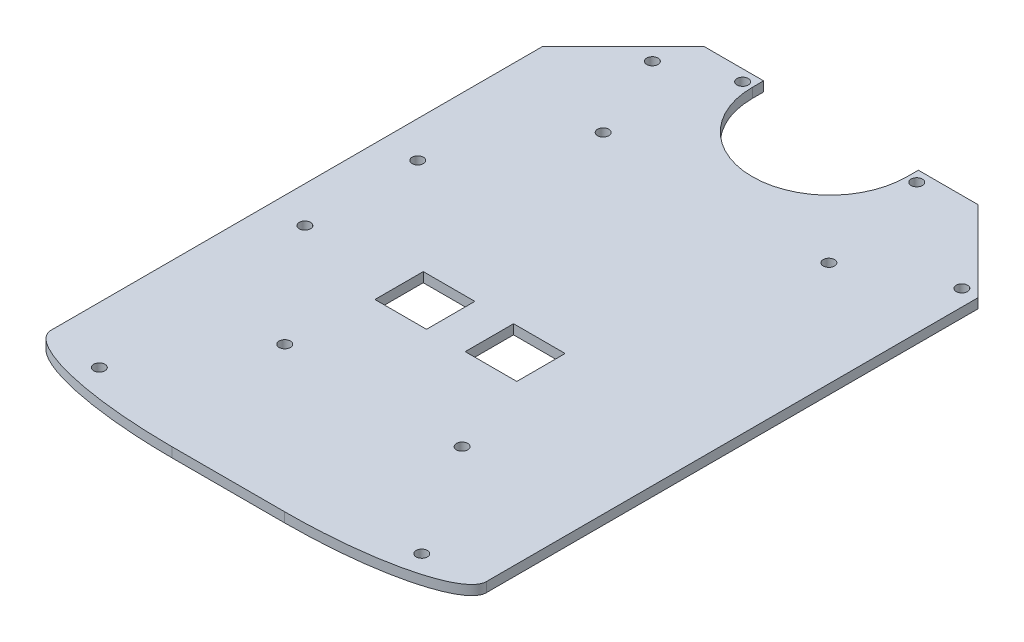
ISO-10303-21;
HEADER;
FILE_DESCRIPTION(('STEP AP214'),'2;1');
FILE_NAME('part.step','',(''),(''),'','','');
FILE_SCHEMA(('AUTOMOTIVE_DESIGN { 1 0 10303 214 1 1 1 1 }'));
ENDSEC;
DATA;
#1=APPLICATION_CONTEXT('core data for automotive mechanical design processes');
#2=APPLICATION_PROTOCOL_DEFINITION('international standard','automotive_design',2000,#1);
#3=PRODUCT_CONTEXT('',#1,'mechanical');
#4=PRODUCT('Part','Part','',(#3));
#5=PRODUCT_RELATED_PRODUCT_CATEGORY('part','',(#4));
#6=PRODUCT_DEFINITION_FORMATION('','',#4);
#7=PRODUCT_DEFINITION_CONTEXT('part definition',#1,'design');
#8=PRODUCT_DEFINITION('design','',#6,#7);
#9=PRODUCT_DEFINITION_SHAPE('','',#8);
#10=(LENGTH_UNIT() NAMED_UNIT(*) SI_UNIT(.MILLI.,.METRE.));
#11=(NAMED_UNIT(*) PLANE_ANGLE_UNIT() SI_UNIT($,.RADIAN.));
#12=(NAMED_UNIT(*) SI_UNIT($,.STERADIAN.) SOLID_ANGLE_UNIT());
#13=UNCERTAINTY_MEASURE_WITH_UNIT(LENGTH_MEASURE(1.E-05),#10,'distance_accuracy_value','');
#14=(GEOMETRIC_REPRESENTATION_CONTEXT(3) GLOBAL_UNCERTAINTY_ASSIGNED_CONTEXT((#13)) GLOBAL_UNIT_ASSIGNED_CONTEXT((#10,
#11,#12)) REPRESENTATION_CONTEXT('',''));
#15=CARTESIAN_POINT('',(0.,0.,0.));
#16=DIRECTION('',(0.,0.,1.));
#17=DIRECTION('',(1.,0.,0.));
#18=AXIS2_PLACEMENT_3D('',#15,#16,#17);
#19=CARTESIAN_POINT('',(-67.5,3.,-95.));
#20=DIRECTION('',(0.,0.,1.));
#21=DIRECTION('',(1.,0.,0.));
#22=AXIS2_PLACEMENT_3D('',#19,#20,#21);
#23=PLANE('',#22);
#24=DIRECTION('',(-1.,0.,0.));
#25=VECTOR('',#24,1.);
#26=CARTESIAN_POINT('',(-67.5,3.,-95.));
#27=LINE('',#26,#25);
#28=CARTESIAN_POINT('',(-24.,3.,-95.));
#29=VERTEX_POINT('',#28);
#30=CARTESIAN_POINT('',(-42.5,3.,-95.));
#31=VERTEX_POINT('',#30);
#32=EDGE_CURVE('E310',#29,#31,#27,.T.);
#33=ORIENTED_EDGE('',*,*,#32,.F.);
#34=DIRECTION('',(0.,1.,0.));
#35=VECTOR('',#34,1.);
#36=CARTESIAN_POINT('',(-24.,-0.25,-95.));
#37=LINE('',#36,#35);
#38=CARTESIAN_POINT('',(-24.,0.,-95.));
#39=VERTEX_POINT('',#38);
#40=EDGE_CURVE('E271',#39,#29,#37,.T.);
#41=ORIENTED_EDGE('',*,*,#40,.F.);
#42=DIRECTION('',(-1.,0.,0.));
#43=VECTOR('',#42,1.);
#44=CARTESIAN_POINT('',(-67.5,0.,-95.));
#45=LINE('',#44,#43);
#46=CARTESIAN_POINT('',(-42.5,0.,-95.));
#47=VERTEX_POINT('',#46);
#48=EDGE_CURVE('E459',#39,#47,#45,.T.);
#49=ORIENTED_EDGE('',*,*,#48,.T.);
#50=DIRECTION('',(0.,1.,0.));
#51=VECTOR('',#50,1.);
#52=CARTESIAN_POINT('',(-42.5,3.,-95.));
#53=LINE('',#52,#51);
#54=EDGE_CURVE('E473',#47,#31,#53,.T.);
#55=ORIENTED_EDGE('',*,*,#54,.T.);
#56=EDGE_LOOP('',(#33,#41,#49,#55));
#57=FACE_BOUND('',#56,.T.);
#58=ADVANCED_FACE('F41',(#57),#23,.F.);
#59=CARTESIAN_POINT('',(67.5,3.,-95.));
#60=DIRECTION('',(-1.,0.,0.));
#61=DIRECTION('',(0.,0.,1.));
#62=AXIS2_PLACEMENT_3D('',#59,#60,#61);
#63=PLANE('',#62);
#64=DIRECTION('',(0.,0.,-1.));
#65=VECTOR('',#64,1.);
#66=CARTESIAN_POINT('',(67.5,0.,-95.));
#67=LINE('',#66,#65);
#68=CARTESIAN_POINT('',(67.5,0.,82.5));
#69=VERTEX_POINT('',#68);
#70=CARTESIAN_POINT('',(67.5,0.,-70.));
#71=VERTEX_POINT('',#70);
#72=EDGE_CURVE('E298',#69,#71,#67,.T.);
#73=ORIENTED_EDGE('',*,*,#72,.T.);
#74=DIRECTION('',(0.,1.,0.));
#75=VECTOR('',#74,1.);
#76=CARTESIAN_POINT('',(67.5,3.,-70.));
#77=LINE('',#76,#75);
#78=CARTESIAN_POINT('',(67.5,3.,-70.));
#79=VERTEX_POINT('',#78);
#80=EDGE_CURVE('E577',#71,#79,#77,.T.);
#81=ORIENTED_EDGE('',*,*,#80,.T.);
#82=DIRECTION('',(0.,0.,-1.));
#83=VECTOR('',#82,1.);
#84=CARTESIAN_POINT('',(67.5,3.,-95.));
#85=LINE('',#84,#83);
#86=CARTESIAN_POINT('',(67.5,3.,82.5));
#87=VERTEX_POINT('',#86);
#88=EDGE_CURVE('E306',#87,#79,#85,.T.);
#89=ORIENTED_EDGE('',*,*,#88,.F.);
#90=CARTESIAN_POINT('',(67.5,-0.15,82.5));
#91=CARTESIAN_POINT('',(67.5,0.95,82.5));
#92=CARTESIAN_POINT('',(67.5,2.05,82.5));
#93=CARTESIAN_POINT('',(67.5,3.15,82.5));
#94=(BOUNDED_CURVE() B_SPLINE_CURVE(3,(#90,#91,#92,#93),.UNSPECIFIED.,.F.,
.F.) B_SPLINE_CURVE_WITH_KNOTS((4,4),(-0.00015,0.00315),
.UNSPECIFIED.) CURVE() GEOMETRIC_REPRESENTATION_ITEM() RATIONAL_B_SPLINE_CURVE((1.,1.,1.,1.)) REPRESENTATION_ITEM(''));
#95=EDGE_CURVE('E320',#87,#69,#94,.F.);
#96=ORIENTED_EDGE('',*,*,#95,.T.);
#97=EDGE_LOOP('',(#73,#81,#89,#96));
#98=FACE_BOUND('',#97,.T.);
#99=ADVANCED_FACE('F327',(#98),#63,.F.);
#100=CARTESIAN_POINT('',(42.4999999999999,0.,-95.));
#101=VERTEX_POINT('',#100);
#102=CARTESIAN_POINT('',(24.,0.,-95.));
#103=VERTEX_POINT('',#102);
#104=EDGE_CURVE('E455',#101,#103,#45,.T.);
#105=ORIENTED_EDGE('',*,*,#104,.T.);
#106=DIRECTION('',(0.,1.,0.));
#107=VECTOR('',#106,1.);
#108=CARTESIAN_POINT('',(24.,-0.25,-95.));
#109=LINE('',#108,#107);
#110=CARTESIAN_POINT('',(24.,3.,-95.));
#111=VERTEX_POINT('',#110);
#112=EDGE_CURVE('E273',#103,#111,#109,.T.);
#113=ORIENTED_EDGE('',*,*,#112,.T.);
#114=CARTESIAN_POINT('',(42.4999999999999,3.,-95.));
#115=VERTEX_POINT('',#114);
#116=EDGE_CURVE('E303',#115,#111,#27,.T.);
#117=ORIENTED_EDGE('',*,*,#116,.F.);
#118=DIRECTION('',(0.,-1.,0.));
#119=VECTOR('',#118,1.);
#120=CARTESIAN_POINT('',(42.4999999999999,3.,-95.));
#121=LINE('',#120,#119);
#122=EDGE_CURVE('E557',#115,#101,#121,.T.);
#123=ORIENTED_EDGE('',*,*,#122,.T.);
#124=EDGE_LOOP('',(#105,#113,#117,#123));
#125=FACE_BOUND('',#124,.T.);
#126=ADVANCED_FACE('F337',(#125),#23,.F.);
#127=CARTESIAN_POINT('',(-67.5,3.,-95.));
#128=DIRECTION('',(1.,0.,0.));
#129=DIRECTION('',(0.,0.,-1.));
#130=AXIS2_PLACEMENT_3D('',#127,#128,#129);
#131=PLANE('',#130);
#132=DIRECTION('',(0.,0.,1.));
#133=VECTOR('',#132,1.);
#134=CARTESIAN_POINT('',(-67.5,3.,-95.));
#135=LINE('',#134,#133);
#136=CARTESIAN_POINT('',(-67.5,3.,-70.));
#137=VERTEX_POINT('',#136);
#138=CARTESIAN_POINT('',(-67.5,3.,82.5));
#139=VERTEX_POINT('',#138);
#140=EDGE_CURVE('E442',#137,#139,#135,.T.);
#141=ORIENTED_EDGE('',*,*,#140,.F.);
#142=DIRECTION('',(0.,-1.,0.));
#143=VECTOR('',#142,1.);
#144=CARTESIAN_POINT('',(-67.5,3.,-70.));
#145=LINE('',#144,#143);
#146=CARTESIAN_POINT('',(-67.5,0.,-70.));
#147=VERTEX_POINT('',#146);
#148=EDGE_CURVE('E467',#137,#147,#145,.T.);
#149=ORIENTED_EDGE('',*,*,#148,.T.);
#150=DIRECTION('',(0.,0.,1.));
#151=VECTOR('',#150,1.);
#152=CARTESIAN_POINT('',(-67.5,0.,-95.));
#153=LINE('',#152,#151);
#154=CARTESIAN_POINT('',(-67.5,0.,82.5000000000001));
#155=VERTEX_POINT('',#154);
#156=EDGE_CURVE('E458',#147,#155,#153,.T.);
#157=ORIENTED_EDGE('',*,*,#156,.T.);
#158=CARTESIAN_POINT('',(-67.5,3.15,82.5));
#159=CARTESIAN_POINT('',(-67.5,2.05,82.5));
#160=CARTESIAN_POINT('',(-67.5,0.95,82.5));
#161=CARTESIAN_POINT('',(-67.5,-0.15,82.5));
#162=(BOUNDED_CURVE() B_SPLINE_CURVE(3,(#158,#159,#160,#161),.UNSPECIFIED.,.F.,
.F.) B_SPLINE_CURVE_WITH_KNOTS((4,4),(-0.00015,0.00315),
.UNSPECIFIED.) CURVE() GEOMETRIC_REPRESENTATION_ITEM() RATIONAL_B_SPLINE_CURVE((1.,1.,1.,1.)) REPRESENTATION_ITEM(''));
#163=EDGE_CURVE('E422',#155,#139,#162,.F.);
#164=ORIENTED_EDGE('',*,*,#163,.T.);
#165=EDGE_LOOP('',(#141,#149,#157,#164));
#166=FACE_BOUND('',#165,.T.);
#167=ADVANCED_FACE('F546',(#166),#131,.F.);
#168=CARTESIAN_POINT('',(-67.5,3.,95.));
#169=DIRECTION('',(0.,0.,-1.));
#170=DIRECTION('',(-1.,0.,0.));
#171=AXIS2_PLACEMENT_3D('',#168,#169,#170);
#172=PLANE('',#171);
#173=DIRECTION('',(1.,0.,0.));
#174=VECTOR('',#173,1.);
#175=CARTESIAN_POINT('',(-67.5,0.,95.));
#176=LINE('',#175,#174);
#177=CARTESIAN_POINT('',(-17.5,0.,95.));
#178=VERTEX_POINT('',#177);
#179=CARTESIAN_POINT('',(17.5,0.,95.));
#180=VERTEX_POINT('',#179);
#181=EDGE_CURVE('E311',#178,#180,#176,.T.);
#182=ORIENTED_EDGE('',*,*,#181,.T.);
#183=CARTESIAN_POINT('',(17.5,3.15,95.));
#184=CARTESIAN_POINT('',(17.5,2.05,95.));
#185=CARTESIAN_POINT('',(17.5,0.95,95.));
#186=CARTESIAN_POINT('',(17.5,-0.15,95.));
#187=(BOUNDED_CURVE() B_SPLINE_CURVE(3,(#183,#184,#185,#186),.UNSPECIFIED.,.F.,
.F.) B_SPLINE_CURVE_WITH_KNOTS((4,4),(-0.00015,0.00315),
.UNSPECIFIED.) CURVE() GEOMETRIC_REPRESENTATION_ITEM() RATIONAL_B_SPLINE_CURVE((1.,1.,1.,1.)) REPRESENTATION_ITEM(''));
#188=CARTESIAN_POINT('',(17.5,3.,95.));
#189=VERTEX_POINT('',#188);
#190=EDGE_CURVE('E595',#180,#189,#187,.F.);
#191=ORIENTED_EDGE('',*,*,#190,.T.);
#192=DIRECTION('',(1.,0.,0.));
#193=VECTOR('',#192,1.);
#194=CARTESIAN_POINT('',(-67.5,3.,95.));
#195=LINE('',#194,#193);
#196=CARTESIAN_POINT('',(-17.5,3.,95.));
#197=VERTEX_POINT('',#196);
#198=EDGE_CURVE('E436',#197,#189,#195,.T.);
#199=ORIENTED_EDGE('',*,*,#198,.F.);
#200=CARTESIAN_POINT('',(-17.5,-0.15,95.));
#201=CARTESIAN_POINT('',(-17.5,0.95,95.));
#202=CARTESIAN_POINT('',(-17.5,2.05,95.));
#203=CARTESIAN_POINT('',(-17.5,3.15,95.));
#204=(BOUNDED_CURVE() B_SPLINE_CURVE(3,(#200,#201,#202,#203),.UNSPECIFIED.,.F.,
.F.) B_SPLINE_CURVE_WITH_KNOTS((4,4),(-0.00015,0.00315),
.UNSPECIFIED.) CURVE() GEOMETRIC_REPRESENTATION_ITEM() RATIONAL_B_SPLINE_CURVE((1.,1.,1.,1.)) REPRESENTATION_ITEM(''));
#205=EDGE_CURVE('E431',#197,#178,#204,.F.);
#206=ORIENTED_EDGE('',*,*,#205,.T.);
#207=EDGE_LOOP('',(#182,#191,#199,#206));
#208=FACE_BOUND('',#207,.T.);
#209=ADVANCED_FACE('F551',(#208),#172,.F.);
#210=CARTESIAN_POINT('',(0.,3.,0.));
#211=DIRECTION('',(0.,1.,0.));
#212=DIRECTION('',(0.,0.,1.));
#213=AXIS2_PLACEMENT_3D('',#210,#211,#212);
#214=PLANE('',#213);
#215=DIRECTION('',(0.,0.,1.));
#216=VECTOR('',#215,1.);
#217=CARTESIAN_POINT('',(-25.5349658150149,3.,9.00000000000002));
#218=LINE('',#217,#216);
#219=CARTESIAN_POINT('',(-25.5349658150149,3.,9.00000000000002));
#220=VERTEX_POINT('',#219);
#221=CARTESIAN_POINT('',(-25.5349658150149,3.,24.));
#222=VERTEX_POINT('',#221);
#223=EDGE_CURVE('E56',#220,#222,#218,.T.);
#224=ORIENTED_EDGE('',*,*,#223,.F.);
#225=DIRECTION('',(-1.,0.,0.));
#226=VECTOR('',#225,1.);
#227=CARTESIAN_POINT('',(-25.5349658150149,3.,9.00000000000002));
#228=LINE('',#227,#226);
#229=CARTESIAN_POINT('',(-9.53496581501492,3.,9.00000000000002));
#230=VERTEX_POINT('',#229);
#231=EDGE_CURVE('E202',#230,#220,#228,.T.);
#232=ORIENTED_EDGE('',*,*,#231,.F.);
#233=DIRECTION('',(0.,0.,-1.));
#234=VECTOR('',#233,1.);
#235=CARTESIAN_POINT('',(-9.53496581501492,3.,9.00000000000002));
#236=LINE('',#235,#234);
#237=CARTESIAN_POINT('',(-9.53496581501492,3.,24.));
#238=VERTEX_POINT('',#237);
#239=EDGE_CURVE('E185',#238,#230,#236,.T.);
#240=ORIENTED_EDGE('',*,*,#239,.F.);
#241=DIRECTION('',(1.,0.,0.));
#242=VECTOR('',#241,1.);
#243=CARTESIAN_POINT('',(-25.5349658150149,3.,24.));
#244=LINE('',#243,#242);
#245=EDGE_CURVE('E195',#222,#238,#244,.T.);
#246=ORIENTED_EDGE('',*,*,#245,.F.);
#247=EDGE_LOOP('',(#224,#232,#240,#246));
#248=FACE_BOUND('',#247,.T.);
#249=DIRECTION('',(0.,0.,1.));
#250=VECTOR('',#249,1.);
#251=CARTESIAN_POINT('',(2.46503418498508,3.,9.00000000000002));
#252=LINE('',#251,#250);
#253=CARTESIAN_POINT('',(2.46503418498508,3.,9.00000000000002));
#254=VERTEX_POINT('',#253);
#255=CARTESIAN_POINT('',(2.46503418498508,3.,24.));
#256=VERTEX_POINT('',#255);
#257=EDGE_CURVE('E64',#254,#256,#252,.T.);
#258=ORIENTED_EDGE('',*,*,#257,.F.);
#259=DIRECTION('',(-1.,0.,0.));
#260=VECTOR('',#259,1.);
#261=CARTESIAN_POINT('',(2.46503418498508,3.,9.00000000000002));
#262=LINE('',#261,#260);
#263=CARTESIAN_POINT('',(18.4650341849851,3.,9.00000000000002));
#264=VERTEX_POINT('',#263);
#265=EDGE_CURVE('E219',#264,#254,#262,.T.);
#266=ORIENTED_EDGE('',*,*,#265,.F.);
#267=DIRECTION('',(0.,0.,-1.));
#268=VECTOR('',#267,1.);
#269=CARTESIAN_POINT('',(18.4650341849851,3.,9.00000000000002));
#270=LINE('',#269,#268);
#271=CARTESIAN_POINT('',(18.4650341849851,3.,24.));
#272=VERTEX_POINT('',#271);
#273=EDGE_CURVE('E216',#272,#264,#270,.T.);
#274=ORIENTED_EDGE('',*,*,#273,.F.);
#275=DIRECTION('',(1.,0.,0.));
#276=VECTOR('',#275,1.);
#277=CARTESIAN_POINT('',(2.46503418498508,3.,24.));
#278=LINE('',#277,#276);
#279=EDGE_CURVE('E213',#256,#272,#278,.T.);
#280=ORIENTED_EDGE('',*,*,#279,.F.);
#281=EDGE_LOOP('',(#258,#266,#274,#280));
#282=FACE_BOUND('',#281,.T.);
#283=CARTESIAN_POINT('',(62.5,3.,-70.));
#284=DIRECTION('',(0.,1.,0.));
#285=DIRECTION('',(0.,0.,1.));
#286=AXIS2_PLACEMENT_3D('',#283,#284,#285);
#287=CIRCLE('',#286,1.75);
#288=CARTESIAN_POINT('',(62.5,3.,-68.25));
#289=VERTEX_POINT('',#288);
#290=EDGE_CURVE('E230',#289,#289,#287,.T.);
#291=ORIENTED_EDGE('',*,*,#290,.F.);
#292=EDGE_LOOP('',(#291));
#293=FACE_BOUND('',#292,.T.);
#294=CARTESIAN_POINT('',(-46.5,3.,-83.));
#295=DIRECTION('',(0.,1.,0.));
#296=DIRECTION('',(0.,0.,1.));
#297=AXIS2_PLACEMENT_3D('',#294,#295,#296);
#298=CIRCLE('',#297,1.75);
#299=CARTESIAN_POINT('',(-46.5,3.,-81.25));
#300=VERTEX_POINT('',#299);
#301=EDGE_CURVE('E209',#300,#300,#298,.T.);
#302=ORIENTED_EDGE('',*,*,#301,.F.);
#303=EDGE_LOOP('',(#302));
#304=FACE_BOUND('',#303,.T.);
#305=CARTESIAN_POINT('',(-56.25,3.,15.));
#306=DIRECTION('',(0.,1.,0.));
#307=DIRECTION('',(0.,0.,1.));
#308=AXIS2_PLACEMENT_3D('',#305,#306,#307);
#309=CIRCLE('',#308,1.75);
#310=CARTESIAN_POINT('',(-56.25,3.,16.75));
#311=VERTEX_POINT('',#310);
#312=EDGE_CURVE('E236',#311,#311,#309,.T.);
#313=ORIENTED_EDGE('',*,*,#312,.F.);
#314=EDGE_LOOP('',(#313));
#315=FACE_BOUND('',#314,.T.);
#316=CARTESIAN_POINT('',(-35.,3.,-56.25));
#317=DIRECTION('',(0.,1.,0.));
#318=DIRECTION('',(0.,0.,1.));
#319=AXIS2_PLACEMENT_3D('',#316,#317,#318);
#320=CIRCLE('',#319,1.75);
#321=CARTESIAN_POINT('',(-35.,3.,-54.5));
#322=VERTEX_POINT('',#321);
#323=EDGE_CURVE('E240',#322,#322,#320,.T.);
#324=ORIENTED_EDGE('',*,*,#323,.F.);
#325=EDGE_LOOP('',(#324));
#326=FACE_BOUND('',#325,.T.);
#327=CARTESIAN_POINT('',(35.,3.,-56.25));
#328=DIRECTION('',(0.,1.,0.));
#329=DIRECTION('',(0.,0.,-1.));
#330=AXIS2_PLACEMENT_3D('',#327,#328,#329);
#331=CIRCLE('',#330,1.75);
#332=CARTESIAN_POINT('',(35.,3.,-58.));
#333=VERTEX_POINT('',#332);
#334=EDGE_CURVE('E243',#333,#333,#331,.T.);
#335=ORIENTED_EDGE('',*,*,#334,.F.);
#336=EDGE_LOOP('',(#335));
#337=FACE_BOUND('',#336,.T.);
#338=CARTESIAN_POINT('',(-56.25,3.,-20.));
#339=DIRECTION('',(0.,1.,0.));
#340=DIRECTION('',(0.,0.,1.));
#341=AXIS2_PLACEMENT_3D('',#338,#339,#340);
#342=CIRCLE('',#341,1.75);
#343=CARTESIAN_POINT('',(-56.25,3.,-18.25));
#344=VERTEX_POINT('',#343);
#345=EDGE_CURVE('E246',#344,#344,#342,.T.);
#346=ORIENTED_EDGE('',*,*,#345,.F.);
#347=EDGE_LOOP('',(#346));
#348=FACE_BOUND('',#347,.T.);
#349=CARTESIAN_POINT('',(-27.,3.,-91.5));
#350=DIRECTION('',(0.,1.,0.));
#351=DIRECTION('',(0.,0.,1.));
#352=AXIS2_PLACEMENT_3D('',#349,#350,#351);
#353=CIRCLE('',#352,1.75);
#354=CARTESIAN_POINT('',(-27.,3.,-89.75));
#355=VERTEX_POINT('',#354);
#356=EDGE_CURVE('E250',#355,#355,#353,.T.);
#357=ORIENTED_EDGE('',*,*,#356,.F.);
#358=EDGE_LOOP('',(#357));
#359=FACE_BOUND('',#358,.T.);
#360=CARTESIAN_POINT('',(27.,3.,-91.5));
#361=DIRECTION('',(0.,1.,0.));
#362=DIRECTION('',(0.,0.,1.));
#363=AXIS2_PLACEMENT_3D('',#360,#361,#362);
#364=CIRCLE('',#363,1.75);
#365=CARTESIAN_POINT('',(27.,3.,-89.75));
#366=VERTEX_POINT('',#365);
#367=EDGE_CURVE('E254',#366,#366,#364,.T.);
#368=ORIENTED_EDGE('',*,*,#367,.F.);
#369=EDGE_LOOP('',(#368));
#370=FACE_BOUND('',#369,.T.);
#371=DIRECTION('',(0.,0.,1.));
#372=VECTOR('',#371,1.);
#373=CARTESIAN_POINT('',(-24.,3.,-95.));
#374=LINE('',#373,#372);
#375=CARTESIAN_POINT('',(-24.,3.,-91.5));
#376=VERTEX_POINT('',#375);
#377=EDGE_CURVE('E264',#29,#376,#374,.T.);
#378=ORIENTED_EDGE('',*,*,#377,.F.);
#379=ORIENTED_EDGE('',*,*,#32,.T.);
#380=DIRECTION('',(0.707106781186548,0.,-0.707106781186547));
#381=VECTOR('',#380,1.);
#382=CARTESIAN_POINT('',(-68.7499999999999,3.,-68.7500000000001));
#383=LINE('',#382,#381);
#384=EDGE_CURVE('E476',#31,#137,#383,.F.);
#385=ORIENTED_EDGE('',*,*,#384,.T.);
#386=ORIENTED_EDGE('',*,*,#140,.T.);
#387=CARTESIAN_POINT('',(-17.5,3.,95.));
#388=CARTESIAN_POINT('',(-67.5,3.,95.));
#389=CARTESIAN_POINT('',(-67.5,3.,82.5));
#390=(BOUNDED_CURVE() B_SPLINE_CURVE(2,(#387,#388,#389),.UNSPECIFIED.,.F.,
.F.) B_SPLINE_CURVE_WITH_KNOTS((3,3),(0.,1.),
.UNSPECIFIED.) CURVE() GEOMETRIC_REPRESENTATION_ITEM() RATIONAL_B_SPLINE_CURVE((1.,
0.707106781186548,1.)) REPRESENTATION_ITEM(''));
#391=EDGE_CURVE('E427',#139,#197,#390,.F.);
#392=ORIENTED_EDGE('',*,*,#391,.T.);
#393=ORIENTED_EDGE('',*,*,#198,.T.);
#394=CARTESIAN_POINT('',(67.5,3.,82.5));
#395=CARTESIAN_POINT('',(67.5,3.,95.));
#396=CARTESIAN_POINT('',(17.5,3.,95.));
#397=(BOUNDED_CURVE() B_SPLINE_CURVE(2,(#394,#395,#396),.UNSPECIFIED.,.F.,
.F.) B_SPLINE_CURVE_WITH_KNOTS((3,3),(0.,1.),
.UNSPECIFIED.) CURVE() GEOMETRIC_REPRESENTATION_ITEM() RATIONAL_B_SPLINE_CURVE((1.,
0.707106781186548,1.)) REPRESENTATION_ITEM(''));
#398=EDGE_CURVE('E583',#189,#87,#397,.F.);
#399=ORIENTED_EDGE('',*,*,#398,.T.);
#400=ORIENTED_EDGE('',*,*,#88,.T.);
#401=DIRECTION('',(0.707106781186548,0.,0.707106781186547));
#402=VECTOR('',#401,1.);
#403=CARTESIAN_POINT('',(68.7499999999999,3.,-68.7500000000001));
#404=LINE('',#403,#402);
#405=EDGE_CURVE('E464',#79,#115,#404,.F.);
#406=ORIENTED_EDGE('',*,*,#405,.T.);
#407=ORIENTED_EDGE('',*,*,#116,.T.);
#408=DIRECTION('',(0.,0.,-1.));
#409=VECTOR('',#408,1.);
#410=CARTESIAN_POINT('',(24.,3.,-91.5));
#411=LINE('',#410,#409);
#412=CARTESIAN_POINT('',(24.,3.,-91.5));
#413=VERTEX_POINT('',#412);
#414=EDGE_CURVE('E261',#413,#111,#411,.T.);
#415=ORIENTED_EDGE('',*,*,#414,.F.);
#416=CARTESIAN_POINT('',(0.,3.,-91.5));
#417=DIRECTION('',(0.,1.,0.));
#418=DIRECTION('',(0.,0.,1.));
#419=AXIS2_PLACEMENT_3D('',#416,#417,#418);
#420=CIRCLE('',#419,24.);
#421=EDGE_CURVE('E258',#376,#413,#420,.T.);
#422=ORIENTED_EDGE('',*,*,#421,.F.);
#423=EDGE_LOOP('',(#378,#379,#385,#386,#392,#393,#399,#400,#406,#407,#415,#422));
#424=FACE_BOUND('',#423,.T.);
#425=CARTESIAN_POINT('',(50.,3.,85.));
#426=DIRECTION('',(0.,1.,0.));
#427=DIRECTION('',(0.,0.,-1.));
#428=AXIS2_PLACEMENT_3D('',#425,#426,#427);
#429=CIRCLE('',#428,1.75);
#430=CARTESIAN_POINT('',(50.,3.,83.25));
#431=VERTEX_POINT('',#430);
#432=EDGE_CURVE('E270',#431,#431,#429,.T.);
#433=ORIENTED_EDGE('',*,*,#432,.F.);
#434=EDGE_LOOP('',(#433));
#435=FACE_BOUND('',#434,.T.);
#436=CARTESIAN_POINT('',(-50.,3.,85.));
#437=DIRECTION('',(0.,1.,0.));
#438=DIRECTION('',(0.,0.,1.));
#439=AXIS2_PLACEMENT_3D('',#436,#437,#438);
#440=CIRCLE('',#439,1.75);
#441=CARTESIAN_POINT('',(-50.,3.,86.75));
#442=VERTEX_POINT('',#441);
#443=EDGE_CURVE('E287',#442,#442,#440,.T.);
#444=ORIENTED_EDGE('',*,*,#443,.F.);
#445=EDGE_LOOP('',(#444));
#446=FACE_BOUND('',#445,.T.);
#447=CARTESIAN_POINT('',(27.5,3.,50.));
#448=DIRECTION('',(0.,1.,0.));
#449=DIRECTION('',(0.,0.,-1.));
#450=AXIS2_PLACEMENT_3D('',#447,#448,#449);
#451=CIRCLE('',#450,1.75);
#452=CARTESIAN_POINT('',(27.5,3.,48.25));
#453=VERTEX_POINT('',#452);
#454=EDGE_CURVE('E281',#453,#453,#451,.T.);
#455=ORIENTED_EDGE('',*,*,#454,.F.);
#456=EDGE_LOOP('',(#455));
#457=FACE_BOUND('',#456,.T.);
#458=CARTESIAN_POINT('',(-27.5,3.,50.));
#459=DIRECTION('',(0.,1.,0.));
#460=DIRECTION('',(0.,0.,1.));
#461=AXIS2_PLACEMENT_3D('',#458,#459,#460);
#462=CIRCLE('',#461,1.75);
#463=CARTESIAN_POINT('',(-27.5,3.,51.75));
#464=VERTEX_POINT('',#463);
#465=EDGE_CURVE('E280',#464,#464,#462,.T.);
#466=ORIENTED_EDGE('',*,*,#465,.F.);
#467=EDGE_LOOP('',(#466));
#468=FACE_BOUND('',#467,.T.);
#469=ADVANCED_FACE('F199',(#248,#282,#293,#304,#315,#326,#337,#348,#359,#370,#424,#435,#446,
#457,#468),#214,.T.);
#470=CARTESIAN_POINT('',(0.,0.,0.));
#471=DIRECTION('',(0.,1.,0.));
#472=DIRECTION('',(0.,0.,1.));
#473=AXIS2_PLACEMENT_3D('',#470,#471,#472);
#474=PLANE('',#473);
#475=DIRECTION('',(-1.,0.,0.));
#476=VECTOR('',#475,1.);
#477=CARTESIAN_POINT('',(0.,0.,9.00000000000002));
#478=LINE('',#477,#476);
#479=CARTESIAN_POINT('',(-9.53496581501492,0.,9.00000000000002));
#480=VERTEX_POINT('',#479);
#481=CARTESIAN_POINT('',(-25.5349658150149,0.,9.00000000000002));
#482=VERTEX_POINT('',#481);
#483=EDGE_CURVE('E49',#480,#482,#478,.T.);
#484=ORIENTED_EDGE('',*,*,#483,.T.);
#485=DIRECTION('',(0.,0.,1.));
#486=VECTOR('',#485,1.);
#487=CARTESIAN_POINT('',(-25.5349658150149,0.,0.));
#488=LINE('',#487,#486);
#489=CARTESIAN_POINT('',(-25.5349658150149,0.,24.));
#490=VERTEX_POINT('',#489);
#491=EDGE_CURVE('E12',#482,#490,#488,.T.);
#492=ORIENTED_EDGE('',*,*,#491,.T.);
#493=DIRECTION('',(1.,0.,0.));
#494=VECTOR('',#493,1.);
#495=CARTESIAN_POINT('',(0.,0.,24.));
#496=LINE('',#495,#494);
#497=CARTESIAN_POINT('',(-9.53496581501492,0.,24.));
#498=VERTEX_POINT('',#497);
#499=EDGE_CURVE('E517',#490,#498,#496,.T.);
#500=ORIENTED_EDGE('',*,*,#499,.T.);
#501=DIRECTION('',(0.,0.,-1.));
#502=VECTOR('',#501,1.);
#503=CARTESIAN_POINT('',(-9.53496581501492,0.,0.));
#504=LINE('',#503,#502);
#505=EDGE_CURVE('E188',#498,#480,#504,.T.);
#506=ORIENTED_EDGE('',*,*,#505,.T.);
#507=EDGE_LOOP('',(#484,#492,#500,#506));
#508=FACE_BOUND('',#507,.T.);
#509=DIRECTION('',(-1.,0.,0.));
#510=VECTOR('',#509,1.);
#511=CARTESIAN_POINT('',(0.,0.,9.00000000000002));
#512=LINE('',#511,#510);
#513=CARTESIAN_POINT('',(18.4650341849851,0.,9.00000000000002));
#514=VERTEX_POINT('',#513);
#515=CARTESIAN_POINT('',(2.46503418498508,0.,9.00000000000002));
#516=VERTEX_POINT('',#515);
#517=EDGE_CURVE('E511',#514,#516,#512,.T.);
#518=ORIENTED_EDGE('',*,*,#517,.T.);
#519=DIRECTION('',(0.,0.,1.));
#520=VECTOR('',#519,1.);
#521=CARTESIAN_POINT('',(2.46503418498508,0.,0.));
#522=LINE('',#521,#520);
#523=CARTESIAN_POINT('',(2.46503418498508,0.,24.));
#524=VERTEX_POINT('',#523);
#525=EDGE_CURVE('E514',#516,#524,#522,.T.);
#526=ORIENTED_EDGE('',*,*,#525,.T.);
#527=DIRECTION('',(1.,0.,0.));
#528=VECTOR('',#527,1.);
#529=CARTESIAN_POINT('',(0.,0.,24.));
#530=LINE('',#529,#528);
#531=CARTESIAN_POINT('',(18.4650341849851,0.,24.));
#532=VERTEX_POINT('',#531);
#533=EDGE_CURVE('E487',#524,#532,#530,.T.);
#534=ORIENTED_EDGE('',*,*,#533,.T.);
#535=DIRECTION('',(0.,0.,-1.));
#536=VECTOR('',#535,1.);
#537=CARTESIAN_POINT('',(18.4650341849851,0.,0.));
#538=LINE('',#537,#536);
#539=EDGE_CURVE('E508',#532,#514,#538,.T.);
#540=ORIENTED_EDGE('',*,*,#539,.T.);
#541=EDGE_LOOP('',(#518,#526,#534,#540));
#542=FACE_BOUND('',#541,.T.);
#543=CARTESIAN_POINT('',(62.5,0.,-70.));
#544=DIRECTION('',(0.,1.,0.));
#545=DIRECTION('',(0.,0.,1.));
#546=AXIS2_PLACEMENT_3D('',#543,#544,#545);
#547=CIRCLE('',#546,1.75);
#548=CARTESIAN_POINT('',(62.5,0.,-68.25));
#549=VERTEX_POINT('',#548);
#550=EDGE_CURVE('E249',#549,#549,#547,.T.);
#551=ORIENTED_EDGE('',*,*,#550,.T.);
#552=EDGE_LOOP('',(#551));
#553=FACE_BOUND('',#552,.T.);
#554=CARTESIAN_POINT('',(-46.5,0.,-83.));
#555=DIRECTION('',(0.,1.,0.));
#556=DIRECTION('',(0.,0.,1.));
#557=AXIS2_PLACEMENT_3D('',#554,#555,#556);
#558=CIRCLE('',#557,1.75);
#559=CARTESIAN_POINT('',(-46.5,0.,-81.25));
#560=VERTEX_POINT('',#559);
#561=EDGE_CURVE('E233',#560,#560,#558,.T.);
#562=ORIENTED_EDGE('',*,*,#561,.T.);
#563=EDGE_LOOP('',(#562));
#564=FACE_BOUND('',#563,.T.);
#565=CARTESIAN_POINT('',(-56.25,0.,15.));
#566=DIRECTION('',(0.,1.,0.));
#567=DIRECTION('',(0.,0.,1.));
#568=AXIS2_PLACEMENT_3D('',#565,#566,#567);
#569=CIRCLE('',#568,1.75);
#570=CARTESIAN_POINT('',(-56.25,0.,16.75));
#571=VERTEX_POINT('',#570);
#572=EDGE_CURVE('E257',#571,#571,#569,.T.);
#573=ORIENTED_EDGE('',*,*,#572,.T.);
#574=EDGE_LOOP('',(#573));
#575=FACE_BOUND('',#574,.T.);
#576=CARTESIAN_POINT('',(-35.,0.,-56.25));
#577=DIRECTION('',(0.,1.,0.));
#578=DIRECTION('',(0.,0.,1.));
#579=AXIS2_PLACEMENT_3D('',#576,#577,#578);
#580=CIRCLE('',#579,1.75);
#581=CARTESIAN_POINT('',(-35.,0.,-54.5));
#582=VERTEX_POINT('',#581);
#583=EDGE_CURVE('E497',#582,#582,#580,.T.);
#584=ORIENTED_EDGE('',*,*,#583,.T.);
#585=EDGE_LOOP('',(#584));
#586=FACE_BOUND('',#585,.T.);
#587=CARTESIAN_POINT('',(35.,0.,-56.25));
#588=DIRECTION('',(0.,1.,0.));
#589=DIRECTION('',(0.,0.,1.));
#590=AXIS2_PLACEMENT_3D('',#587,#588,#589);
#591=CIRCLE('',#590,1.75);
#592=CARTESIAN_POINT('',(35.,0.,-54.5));
#593=VERTEX_POINT('',#592);
#594=EDGE_CURVE('E494',#593,#593,#591,.T.);
#595=ORIENTED_EDGE('',*,*,#594,.T.);
#596=EDGE_LOOP('',(#595));
#597=FACE_BOUND('',#596,.T.);
#598=CARTESIAN_POINT('',(-56.25,0.,-20.));
#599=DIRECTION('',(0.,1.,0.));
#600=DIRECTION('',(0.,0.,1.));
#601=AXIS2_PLACEMENT_3D('',#598,#599,#600);
#602=CIRCLE('',#601,1.75);
#603=CARTESIAN_POINT('',(-56.25,0.,-18.25));
#604=VERTEX_POINT('',#603);
#605=EDGE_CURVE('E239',#604,#604,#602,.T.);
#606=ORIENTED_EDGE('',*,*,#605,.T.);
#607=EDGE_LOOP('',(#606));
#608=FACE_BOUND('',#607,.T.);
#609=CARTESIAN_POINT('',(-27.,0.,-91.5));
#610=DIRECTION('',(0.,1.,0.));
#611=DIRECTION('',(0.,0.,1.));
#612=AXIS2_PLACEMENT_3D('',#609,#610,#611);
#613=CIRCLE('',#612,1.75);
#614=CARTESIAN_POINT('',(-27.,0.,-89.75));
#615=VERTEX_POINT('',#614);
#616=EDGE_CURVE('E262',#615,#615,#613,.T.);
#617=ORIENTED_EDGE('',*,*,#616,.T.);
#618=EDGE_LOOP('',(#617));
#619=FACE_BOUND('',#618,.T.);
#620=CARTESIAN_POINT('',(27.,0.,-91.5));
#621=DIRECTION('',(0.,1.,0.));
#622=DIRECTION('',(0.,0.,1.));
#623=AXIS2_PLACEMENT_3D('',#620,#621,#622);
#624=CIRCLE('',#623,1.75);
#625=CARTESIAN_POINT('',(27.,0.,-89.75));
#626=VERTEX_POINT('',#625);
#627=EDGE_CURVE('E253',#626,#626,#624,.T.);
#628=ORIENTED_EDGE('',*,*,#627,.T.);
#629=EDGE_LOOP('',(#628));
#630=FACE_BOUND('',#629,.T.);
#631=CARTESIAN_POINT('',(50.,0.,85.));
#632=DIRECTION('',(0.,1.,0.));
#633=DIRECTION('',(0.,0.,-1.));
#634=AXIS2_PLACEMENT_3D('',#631,#632,#633);
#635=CIRCLE('',#634,1.75);
#636=CARTESIAN_POINT('',(50.,0.,83.25));
#637=VERTEX_POINT('',#636);
#638=EDGE_CURVE('E290',#637,#637,#635,.T.);
#639=ORIENTED_EDGE('',*,*,#638,.T.);
#640=EDGE_LOOP('',(#639));
#641=FACE_BOUND('',#640,.T.);
#642=CARTESIAN_POINT('',(-50.,0.,85.));
#643=DIRECTION('',(0.,1.,0.));
#644=DIRECTION('',(0.,0.,1.));
#645=AXIS2_PLACEMENT_3D('',#642,#643,#644);
#646=CIRCLE('',#645,1.75);
#647=CARTESIAN_POINT('',(-50.,0.,86.75));
#648=VERTEX_POINT('',#647);
#649=EDGE_CURVE('E284',#648,#648,#646,.T.);
#650=ORIENTED_EDGE('',*,*,#649,.T.);
#651=EDGE_LOOP('',(#650));
#652=FACE_BOUND('',#651,.T.);
#653=CARTESIAN_POINT('',(27.5,0.,50.));
#654=DIRECTION('',(0.,1.,0.));
#655=DIRECTION('',(0.,0.,-1.));
#656=AXIS2_PLACEMENT_3D('',#653,#654,#655);
#657=CIRCLE('',#656,1.75);
#658=CARTESIAN_POINT('',(27.5,0.,48.25));
#659=VERTEX_POINT('',#658);
#660=EDGE_CURVE('E277',#659,#659,#657,.T.);
#661=ORIENTED_EDGE('',*,*,#660,.T.);
#662=EDGE_LOOP('',(#661));
#663=FACE_BOUND('',#662,.T.);
#664=CARTESIAN_POINT('',(-27.5,0.,50.));
#665=DIRECTION('',(0.,1.,0.));
#666=DIRECTION('',(0.,0.,1.));
#667=AXIS2_PLACEMENT_3D('',#664,#665,#666);
#668=CIRCLE('',#667,1.75);
#669=CARTESIAN_POINT('',(-27.5,0.,51.75));
#670=VERTEX_POINT('',#669);
#671=EDGE_CURVE('E295',#670,#670,#668,.T.);
#672=ORIENTED_EDGE('',*,*,#671,.T.);
#673=EDGE_LOOP('',(#672));
#674=FACE_BOUND('',#673,.T.);
#675=ORIENTED_EDGE('',*,*,#48,.F.);
#676=DIRECTION('',(0.,0.,1.));
#677=VECTOR('',#676,1.);
#678=CARTESIAN_POINT('',(-24.0000000000001,0.,0.));
#679=LINE('',#678,#677);
#680=CARTESIAN_POINT('',(-24.,0.,-91.5));
#681=VERTEX_POINT('',#680);
#682=EDGE_CURVE('E484',#39,#681,#679,.T.);
#683=ORIENTED_EDGE('',*,*,#682,.T.);
#684=CARTESIAN_POINT('',(0.,0.,-91.5));
#685=DIRECTION('',(0.,1.,0.));
#686=DIRECTION('',(0.,0.,1.));
#687=AXIS2_PLACEMENT_3D('',#684,#685,#686);
#688=CIRCLE('',#687,24.);
#689=CARTESIAN_POINT('',(24.,0.,-91.5));
#690=VERTEX_POINT('',#689);
#691=EDGE_CURVE('E481',#681,#690,#688,.T.);
#692=ORIENTED_EDGE('',*,*,#691,.T.);
#693=DIRECTION('',(0.,0.,-1.));
#694=VECTOR('',#693,1.);
#695=CARTESIAN_POINT('',(24.,0.,0.));
#696=LINE('',#695,#694);
#697=EDGE_CURVE('E478',#690,#103,#696,.T.);
#698=ORIENTED_EDGE('',*,*,#697,.T.);
#699=ORIENTED_EDGE('',*,*,#104,.F.);
#700=DIRECTION('',(-0.707106781186548,0.,-0.707106781186547));
#701=VECTOR('',#700,1.);
#702=CARTESIAN_POINT('',(42.4999999999999,0.,-95.));
#703=LINE('',#702,#701);
#704=EDGE_CURVE('E559',#101,#71,#703,.F.);
#705=ORIENTED_EDGE('',*,*,#704,.T.);
#706=ORIENTED_EDGE('',*,*,#72,.F.);
#707=CARTESIAN_POINT('',(17.5,0.,95.));
#708=CARTESIAN_POINT('',(67.5,0.,95.));
#709=CARTESIAN_POINT('',(67.5,0.,82.5));
#710=(BOUNDED_CURVE() B_SPLINE_CURVE(2,(#707,#708,#709),.UNSPECIFIED.,.F.,
.F.) B_SPLINE_CURVE_WITH_KNOTS((3,3),(0.,1.),
.UNSPECIFIED.) CURVE() GEOMETRIC_REPRESENTATION_ITEM() RATIONAL_B_SPLINE_CURVE((1.,
0.707106781186548,1.)) REPRESENTATION_ITEM(''));
#711=EDGE_CURVE('E623',#69,#180,#710,.F.);
#712=ORIENTED_EDGE('',*,*,#711,.T.);
#713=ORIENTED_EDGE('',*,*,#181,.F.);
#714=CARTESIAN_POINT('',(-67.5,0.,82.5));
#715=CARTESIAN_POINT('',(-67.5,0.,95.));
#716=CARTESIAN_POINT('',(-17.5,0.,95.));
#717=(BOUNDED_CURVE() B_SPLINE_CURVE(2,(#714,#715,#716),.UNSPECIFIED.,.F.,
.F.) B_SPLINE_CURVE_WITH_KNOTS((3,3),(0.,1.),
.UNSPECIFIED.) CURVE() GEOMETRIC_REPRESENTATION_ITEM() RATIONAL_B_SPLINE_CURVE((1.,
0.707106781186548,1.)) REPRESENTATION_ITEM(''));
#718=EDGE_CURVE('E425',#178,#155,#717,.F.);
#719=ORIENTED_EDGE('',*,*,#718,.T.);
#720=ORIENTED_EDGE('',*,*,#156,.F.);
#721=DIRECTION('',(-0.707106781186548,0.,0.707106781186547));
#722=VECTOR('',#721,1.);
#723=CARTESIAN_POINT('',(-67.5,0.,-70.));
#724=LINE('',#723,#722);
#725=EDGE_CURVE('E470',#147,#47,#724,.F.);
#726=ORIENTED_EDGE('',*,*,#725,.T.);
#727=EDGE_LOOP('',(#675,#683,#692,#698,#699,#705,#706,#712,#713,#719,#720,#726));
#728=FACE_BOUND('',#727,.T.);
#729=ADVANCED_FACE('F521',(#508,#542,#553,#564,#575,#586,#597,#608,#619,#630,#641,#652,#663,
#674,#728),#474,.F.);
#730=CARTESIAN_POINT('',(-27.5,0.,50.));
#731=DIRECTION('',(0.,1.,0.));
#732=DIRECTION('',(0.,0.,1.));
#733=AXIS2_PLACEMENT_3D('',#730,#731,#732);
#734=CYLINDRICAL_SURFACE('',#733,1.75);
#735=ORIENTED_EDGE('',*,*,#671,.F.);
#736=EDGE_LOOP('',(#735));
#737=FACE_BOUND('',#736,.T.);
#738=ORIENTED_EDGE('',*,*,#465,.T.);
#739=EDGE_LOOP('',(#738));
#740=FACE_BOUND('',#739,.T.);
#741=ADVANCED_FACE('F638',(#737,#740),#734,.F.);
#742=CARTESIAN_POINT('',(27.5,0.,50.));
#743=DIRECTION('',(0.,1.,0.));
#744=DIRECTION('',(0.,0.,1.));
#745=AXIS2_PLACEMENT_3D('',#742,#743,#744);
#746=CYLINDRICAL_SURFACE('',#745,1.75);
#747=ORIENTED_EDGE('',*,*,#660,.F.);
#748=EDGE_LOOP('',(#747));
#749=FACE_BOUND('',#748,.T.);
#750=ORIENTED_EDGE('',*,*,#454,.T.);
#751=EDGE_LOOP('',(#750));
#752=FACE_BOUND('',#751,.T.);
#753=ADVANCED_FACE('F717',(#749,#752),#746,.F.);
#754=CARTESIAN_POINT('',(-50.,0.,85.));
#755=DIRECTION('',(0.,1.,0.));
#756=DIRECTION('',(0.,0.,1.));
#757=AXIS2_PLACEMENT_3D('',#754,#755,#756);
#758=CYLINDRICAL_SURFACE('',#757,1.75);
#759=ORIENTED_EDGE('',*,*,#649,.F.);
#760=EDGE_LOOP('',(#759));
#761=FACE_BOUND('',#760,.T.);
#762=ORIENTED_EDGE('',*,*,#443,.T.);
#763=EDGE_LOOP('',(#762));
#764=FACE_BOUND('',#763,.T.);
#765=ADVANCED_FACE('F724',(#761,#764),#758,.F.);
#766=CARTESIAN_POINT('',(50.,0.,85.));
#767=DIRECTION('',(0.,1.,0.));
#768=DIRECTION('',(0.,0.,1.));
#769=AXIS2_PLACEMENT_3D('',#766,#767,#768);
#770=CYLINDRICAL_SURFACE('',#769,1.75);
#771=ORIENTED_EDGE('',*,*,#638,.F.);
#772=EDGE_LOOP('',(#771));
#773=FACE_BOUND('',#772,.T.);
#774=ORIENTED_EDGE('',*,*,#432,.T.);
#775=EDGE_LOOP('',(#774));
#776=FACE_BOUND('',#775,.T.);
#777=ADVANCED_FACE('F349',(#773,#776),#770,.F.);
#778=CARTESIAN_POINT('',(-17.5,3.15,95.));
#779=CARTESIAN_POINT('',(-17.5,2.05,95.));
#780=CARTESIAN_POINT('',(-17.5,0.95,95.));
#781=CARTESIAN_POINT('',(-17.5,-0.15,95.));
#782=CARTESIAN_POINT('',(-67.5,3.15,95.));
#783=CARTESIAN_POINT('',(-67.5,2.05,95.));
#784=CARTESIAN_POINT('',(-67.5,0.949999999999999,95.));
#785=CARTESIAN_POINT('',(-67.5,-0.15,95.));
#786=CARTESIAN_POINT('',(-67.5,3.15,82.5));
#787=CARTESIAN_POINT('',(-67.5,2.05,82.5));
#788=CARTESIAN_POINT('',(-67.5,0.95,82.5));
#789=CARTESIAN_POINT('',(-67.5,-0.15,82.5));
#790=(BOUNDED_SURFACE() B_SPLINE_SURFACE(2,3,((#778,#779,#780,#781),(#782,#783,#784,#785),(#786,
#787,#788,#789)),.UNSPECIFIED.,.F.,.F.,.F.) B_SPLINE_SURFACE_WITH_KNOTS((3,3),(4,4),(0.,1.),
(-0.00015,0.00315),
.UNSPECIFIED.) GEOMETRIC_REPRESENTATION_ITEM() RATIONAL_B_SPLINE_SURFACE(((1.,1.,1.,1.),
(0.707106781186548,0.707106781186548,0.707106781186548,0.707106781186548),(1.,1.,1.,1.))) REPRESENTATION_ITEM('') SURFACE());
#791=ORIENTED_EDGE('',*,*,#391,.F.);
#792=ORIENTED_EDGE('',*,*,#163,.F.);
#793=ORIENTED_EDGE('',*,*,#718,.F.);
#794=ORIENTED_EDGE('',*,*,#205,.F.);
#795=EDGE_LOOP('',(#791,#792,#793,#794));
#796=FACE_BOUND('',#795,.T.);
#797=ADVANCED_FACE('F340',(#796),#790,.T.);
#798=CARTESIAN_POINT('',(67.5,3.15,82.5));
#799=CARTESIAN_POINT('',(67.5,2.05,82.5));
#800=CARTESIAN_POINT('',(67.5,0.95,82.5));
#801=CARTESIAN_POINT('',(67.5,-0.15,82.5));
#802=CARTESIAN_POINT('',(67.5,3.15,95.));
#803=CARTESIAN_POINT('',(67.5,2.05,95.));
#804=CARTESIAN_POINT('',(67.5,0.949999999999999,95.));
#805=CARTESIAN_POINT('',(67.5,-0.15,95.));
#806=CARTESIAN_POINT('',(17.5,3.15,95.));
#807=CARTESIAN_POINT('',(17.5,2.05,95.));
#808=CARTESIAN_POINT('',(17.5,0.95,95.));
#809=CARTESIAN_POINT('',(17.5,-0.15,95.));
#810=(BOUNDED_SURFACE() B_SPLINE_SURFACE(2,3,((#798,#799,#800,#801),(#802,#803,#804,#805),(#806,
#807,#808,#809)),.UNSPECIFIED.,.F.,.F.,.F.) B_SPLINE_SURFACE_WITH_KNOTS((3,3),(4,4),(0.,1.),
(-0.00015,0.00315),
.UNSPECIFIED.) GEOMETRIC_REPRESENTATION_ITEM() RATIONAL_B_SPLINE_SURFACE(((1.,1.,1.,1.),
(0.707106781186548,0.707106781186548,0.707106781186548,0.707106781186548),(1.,1.,1.,1.))) REPRESENTATION_ITEM('') SURFACE());
#811=ORIENTED_EDGE('',*,*,#398,.F.);
#812=ORIENTED_EDGE('',*,*,#190,.F.);
#813=ORIENTED_EDGE('',*,*,#711,.F.);
#814=ORIENTED_EDGE('',*,*,#95,.F.);
#815=EDGE_LOOP('',(#811,#812,#813,#814));
#816=FACE_BOUND('',#815,.T.);
#817=ADVANCED_FACE('F348',(#816),#810,.T.);
#818=CARTESIAN_POINT('',(42.4999999999999,3.,-95.));
#819=DIRECTION('',(-0.707106781186547,0.,0.707106781186548));
#820=DIRECTION('',(0.,-1.,0.));
#821=AXIS2_PLACEMENT_3D('',#818,#819,#820);
#822=PLANE('',#821);
#823=ORIENTED_EDGE('',*,*,#405,.F.);
#824=ORIENTED_EDGE('',*,*,#80,.F.);
#825=ORIENTED_EDGE('',*,*,#704,.F.);
#826=ORIENTED_EDGE('',*,*,#122,.F.);
#827=EDGE_LOOP('',(#823,#824,#825,#826));
#828=FACE_BOUND('',#827,.T.);
#829=ADVANCED_FACE('F579',(#828),#822,.F.);
#830=CARTESIAN_POINT('',(-67.5,3.,-70.));
#831=DIRECTION('',(0.707106781186547,0.,0.707106781186548));
#832=DIRECTION('',(0.,-1.,0.));
#833=AXIS2_PLACEMENT_3D('',#830,#831,#832);
#834=PLANE('',#833);
#835=ORIENTED_EDGE('',*,*,#384,.F.);
#836=ORIENTED_EDGE('',*,*,#54,.F.);
#837=ORIENTED_EDGE('',*,*,#725,.F.);
#838=ORIENTED_EDGE('',*,*,#148,.F.);
#839=EDGE_LOOP('',(#835,#836,#837,#838));
#840=FACE_BOUND('',#839,.T.);
#841=ADVANCED_FACE('F43',(#840),#834,.F.);
#842=CARTESIAN_POINT('',(0.,-0.25,-91.5));
#843=DIRECTION('',(0.,1.,0.));
#844=DIRECTION('',(0.,0.,1.));
#845=AXIS2_PLACEMENT_3D('',#842,#843,#844);
#846=CYLINDRICAL_SURFACE('',#845,24.);
#847=DIRECTION('',(0.,1.,0.));
#848=VECTOR('',#847,1.);
#849=CARTESIAN_POINT('',(-24.,-0.25,-91.5));
#850=LINE('',#849,#848);
#851=EDGE_CURVE('E268',#681,#376,#850,.T.);
#852=ORIENTED_EDGE('',*,*,#851,.T.);
#853=ORIENTED_EDGE('',*,*,#421,.T.);
#854=DIRECTION('',(0.,1.,0.));
#855=VECTOR('',#854,1.);
#856=CARTESIAN_POINT('',(24.,-0.25,-91.5));
#857=LINE('',#856,#855);
#858=EDGE_CURVE('E267',#690,#413,#857,.T.);
#859=ORIENTED_EDGE('',*,*,#858,.F.);
#860=ORIENTED_EDGE('',*,*,#691,.F.);
#861=EDGE_LOOP('',(#852,#853,#859,#860));
#862=FACE_BOUND('',#861,.T.);
#863=ADVANCED_FACE('F564',(#862),#846,.F.);
#864=CARTESIAN_POINT('',(-24.,-0.25,-95.));
#865=DIRECTION('',(-1.,0.,0.));
#866=DIRECTION('',(0.,0.,1.));
#867=AXIS2_PLACEMENT_3D('',#864,#865,#866);
#868=PLANE('',#867);
#869=ORIENTED_EDGE('',*,*,#40,.T.);
#870=ORIENTED_EDGE('',*,*,#377,.T.);
#871=ORIENTED_EDGE('',*,*,#851,.F.);
#872=ORIENTED_EDGE('',*,*,#682,.F.);
#873=EDGE_LOOP('',(#869,#870,#871,#872));
#874=FACE_BOUND('',#873,.T.);
#875=ADVANCED_FACE('F763',(#874),#868,.F.);
#876=CARTESIAN_POINT('',(24.,-0.25,-91.5));
#877=DIRECTION('',(1.,0.,0.));
#878=DIRECTION('',(0.,0.,-1.));
#879=AXIS2_PLACEMENT_3D('',#876,#877,#878);
#880=PLANE('',#879);
#881=ORIENTED_EDGE('',*,*,#858,.T.);
#882=ORIENTED_EDGE('',*,*,#414,.T.);
#883=ORIENTED_EDGE('',*,*,#112,.F.);
#884=ORIENTED_EDGE('',*,*,#697,.F.);
#885=EDGE_LOOP('',(#881,#882,#883,#884));
#886=FACE_BOUND('',#885,.T.);
#887=ADVANCED_FACE('F562',(#886),#880,.F.);
#888=CARTESIAN_POINT('',(27.,-0.25,-91.5));
#889=DIRECTION('',(0.,1.,0.));
#890=DIRECTION('',(0.,0.,1.));
#891=AXIS2_PLACEMENT_3D('',#888,#889,#890);
#892=CYLINDRICAL_SURFACE('',#891,1.75);
#893=ORIENTED_EDGE('',*,*,#367,.T.);
#894=EDGE_LOOP('',(#893));
#895=FACE_BOUND('',#894,.T.);
#896=ORIENTED_EDGE('',*,*,#627,.F.);
#897=EDGE_LOOP('',(#896));
#898=FACE_BOUND('',#897,.T.);
#899=ADVANCED_FACE('F777',(#895,#898),#892,.F.);
#900=CARTESIAN_POINT('',(-27.,-0.25,-91.5));
#901=DIRECTION('',(0.,1.,0.));
#902=DIRECTION('',(0.,0.,1.));
#903=AXIS2_PLACEMENT_3D('',#900,#901,#902);
#904=CYLINDRICAL_SURFACE('',#903,1.75);
#905=ORIENTED_EDGE('',*,*,#356,.T.);
#906=EDGE_LOOP('',(#905));
#907=FACE_BOUND('',#906,.T.);
#908=ORIENTED_EDGE('',*,*,#616,.F.);
#909=EDGE_LOOP('',(#908));
#910=FACE_BOUND('',#909,.T.);
#911=ADVANCED_FACE('F784',(#907,#910),#904,.F.);
#912=CARTESIAN_POINT('',(-56.25,-0.25,-20.));
#913=DIRECTION('',(0.,1.,0.));
#914=DIRECTION('',(0.,0.,1.));
#915=AXIS2_PLACEMENT_3D('',#912,#913,#914);
#916=CYLINDRICAL_SURFACE('',#915,1.75);
#917=ORIENTED_EDGE('',*,*,#345,.T.);
#918=EDGE_LOOP('',(#917));
#919=FACE_BOUND('',#918,.T.);
#920=ORIENTED_EDGE('',*,*,#605,.F.);
#921=EDGE_LOOP('',(#920));
#922=FACE_BOUND('',#921,.T.);
#923=ADVANCED_FACE('F792',(#919,#922),#916,.F.);
#924=CARTESIAN_POINT('',(35.,-0.25,-56.25));
#925=DIRECTION('',(0.,1.,0.));
#926=DIRECTION('',(0.,0.,1.));
#927=AXIS2_PLACEMENT_3D('',#924,#925,#926);
#928=CYLINDRICAL_SURFACE('',#927,1.75);
#929=ORIENTED_EDGE('',*,*,#334,.T.);
#930=EDGE_LOOP('',(#929));
#931=FACE_BOUND('',#930,.T.);
#932=ORIENTED_EDGE('',*,*,#594,.F.);
#933=EDGE_LOOP('',(#932));
#934=FACE_BOUND('',#933,.T.);
#935=ADVANCED_FACE('F800',(#931,#934),#928,.F.);
#936=CARTESIAN_POINT('',(-35.,-0.25,-56.25));
#937=DIRECTION('',(0.,1.,0.));
#938=DIRECTION('',(0.,0.,1.));
#939=AXIS2_PLACEMENT_3D('',#936,#937,#938);
#940=CYLINDRICAL_SURFACE('',#939,1.75);
#941=ORIENTED_EDGE('',*,*,#323,.T.);
#942=EDGE_LOOP('',(#941));
#943=FACE_BOUND('',#942,.T.);
#944=ORIENTED_EDGE('',*,*,#583,.F.);
#945=EDGE_LOOP('',(#944));
#946=FACE_BOUND('',#945,.T.);
#947=ADVANCED_FACE('F808',(#943,#946),#940,.F.);
#948=CARTESIAN_POINT('',(-56.25,-0.25,15.));
#949=DIRECTION('',(0.,1.,0.));
#950=DIRECTION('',(0.,0.,1.));
#951=AXIS2_PLACEMENT_3D('',#948,#949,#950);
#952=CYLINDRICAL_SURFACE('',#951,1.75);
#953=ORIENTED_EDGE('',*,*,#312,.T.);
#954=EDGE_LOOP('',(#953));
#955=FACE_BOUND('',#954,.T.);
#956=ORIENTED_EDGE('',*,*,#572,.F.);
#957=EDGE_LOOP('',(#956));
#958=FACE_BOUND('',#957,.T.);
#959=ADVANCED_FACE('F816',(#955,#958),#952,.F.);
#960=CARTESIAN_POINT('',(-46.5,-0.25,-83.));
#961=DIRECTION('',(0.,1.,0.));
#962=DIRECTION('',(0.,0.,1.));
#963=AXIS2_PLACEMENT_3D('',#960,#961,#962);
#964=CYLINDRICAL_SURFACE('',#963,1.75);
#965=ORIENTED_EDGE('',*,*,#301,.T.);
#966=EDGE_LOOP('',(#965));
#967=FACE_BOUND('',#966,.T.);
#968=ORIENTED_EDGE('',*,*,#561,.F.);
#969=EDGE_LOOP('',(#968));
#970=FACE_BOUND('',#969,.T.);
#971=ADVANCED_FACE('F824',(#967,#970),#964,.F.);
#972=CARTESIAN_POINT('',(62.5,-0.25,-70.));
#973=DIRECTION('',(0.,1.,0.));
#974=DIRECTION('',(0.,0.,1.));
#975=AXIS2_PLACEMENT_3D('',#972,#973,#974);
#976=CYLINDRICAL_SURFACE('',#975,1.75);
#977=ORIENTED_EDGE('',*,*,#290,.T.);
#978=EDGE_LOOP('',(#977));
#979=FACE_BOUND('',#978,.T.);
#980=ORIENTED_EDGE('',*,*,#550,.F.);
#981=EDGE_LOOP('',(#980));
#982=FACE_BOUND('',#981,.T.);
#983=ADVANCED_FACE('F832',(#979,#982),#976,.F.);
#984=CARTESIAN_POINT('',(2.46503418498508,-0.25,9.00000000000002));
#985=DIRECTION('',(-1.,0.,0.));
#986=DIRECTION('',(0.,0.,1.));
#987=AXIS2_PLACEMENT_3D('',#984,#985,#986);
#988=PLANE('',#987);
#989=DIRECTION('',(0.,1.,0.));
#990=VECTOR('',#989,1.);
#991=CARTESIAN_POINT('',(2.46503418498508,-0.25,9.00000000000002));
#992=LINE('',#991,#990);
#993=EDGE_CURVE('E223',#516,#254,#992,.T.);
#994=ORIENTED_EDGE('',*,*,#993,.T.);
#995=ORIENTED_EDGE('',*,*,#257,.T.);
#996=DIRECTION('',(0.,1.,0.));
#997=VECTOR('',#996,1.);
#998=CARTESIAN_POINT('',(2.46503418498508,-0.25,24.));
#999=LINE('',#998,#997);
#1000=EDGE_CURVE('E222',#524,#256,#999,.T.);
#1001=ORIENTED_EDGE('',*,*,#1000,.F.);
#1002=ORIENTED_EDGE('',*,*,#525,.F.);
#1003=EDGE_LOOP('',(#994,#995,#1001,#1002));
#1004=FACE_BOUND('',#1003,.T.);
#1005=ADVANCED_FACE('F839',(#1004),#988,.F.);
#1006=CARTESIAN_POINT('',(2.46503418498508,-0.25,9.00000000000002));
#1007=DIRECTION('',(0.,0.,-1.));
#1008=DIRECTION('',(-1.,0.,0.));
#1009=AXIS2_PLACEMENT_3D('',#1006,#1007,#1008);
#1010=PLANE('',#1009);
#1011=DIRECTION('',(0.,1.,0.));
#1012=VECTOR('',#1011,1.);
#1013=CARTESIAN_POINT('',(18.4650341849851,-0.25,9.00000000000002));
#1014=LINE('',#1013,#1012);
#1015=EDGE_CURVE('E225',#514,#264,#1014,.T.);
#1016=ORIENTED_EDGE('',*,*,#1015,.T.);
#1017=ORIENTED_EDGE('',*,*,#265,.T.);
#1018=ORIENTED_EDGE('',*,*,#993,.F.);
#1019=ORIENTED_EDGE('',*,*,#517,.F.);
#1020=EDGE_LOOP('',(#1016,#1017,#1018,#1019));
#1021=FACE_BOUND('',#1020,.T.);
#1022=ADVANCED_FACE('F846',(#1021),#1010,.F.);
#1023=CARTESIAN_POINT('',(18.4650341849851,-0.25,9.00000000000002));
#1024=DIRECTION('',(1.,0.,0.));
#1025=DIRECTION('',(0.,0.,-1.));
#1026=AXIS2_PLACEMENT_3D('',#1023,#1024,#1025);
#1027=PLANE('',#1026);
#1028=DIRECTION('',(0.,1.,0.));
#1029=VECTOR('',#1028,1.);
#1030=CARTESIAN_POINT('',(18.4650341849851,-0.25,24.));
#1031=LINE('',#1030,#1029);
#1032=EDGE_CURVE('E227',#532,#272,#1031,.T.);
#1033=ORIENTED_EDGE('',*,*,#1032,.T.);
#1034=ORIENTED_EDGE('',*,*,#273,.T.);
#1035=ORIENTED_EDGE('',*,*,#1015,.F.);
#1036=ORIENTED_EDGE('',*,*,#539,.F.);
#1037=EDGE_LOOP('',(#1033,#1034,#1035,#1036));
#1038=FACE_BOUND('',#1037,.T.);
#1039=ADVANCED_FACE('F535',(#1038),#1027,.F.);
#1040=CARTESIAN_POINT('',(2.46503418498508,-0.25,24.));
#1041=DIRECTION('',(0.,0.,1.));
#1042=DIRECTION('',(1.,0.,0.));
#1043=AXIS2_PLACEMENT_3D('',#1040,#1041,#1042);
#1044=PLANE('',#1043);
#1045=ORIENTED_EDGE('',*,*,#1000,.T.);
#1046=ORIENTED_EDGE('',*,*,#279,.T.);
#1047=ORIENTED_EDGE('',*,*,#1032,.F.);
#1048=ORIENTED_EDGE('',*,*,#533,.F.);
#1049=EDGE_LOOP('',(#1045,#1046,#1047,#1048));
#1050=FACE_BOUND('',#1049,.T.);
#1051=ADVANCED_FACE('F528',(#1050),#1044,.F.);
#1052=CARTESIAN_POINT('',(-25.5349658150149,-0.25,9.00000000000002));
#1053=DIRECTION('',(-1.,0.,0.));
#1054=DIRECTION('',(0.,0.,1.));
#1055=AXIS2_PLACEMENT_3D('',#1052,#1053,#1054);
#1056=PLANE('',#1055);
#1057=DIRECTION('',(0.,1.,0.));
#1058=VECTOR('',#1057,1.);
#1059=CARTESIAN_POINT('',(-25.5349658150149,-0.25,9.00000000000002));
#1060=LINE('',#1059,#1058);
#1061=EDGE_CURVE('E207',#482,#220,#1060,.T.);
#1062=ORIENTED_EDGE('',*,*,#1061,.T.);
#1063=ORIENTED_EDGE('',*,*,#223,.T.);
#1064=DIRECTION('',(0.,1.,0.));
#1065=VECTOR('',#1064,1.);
#1066=CARTESIAN_POINT('',(-25.5349658150149,-0.25,24.));
#1067=LINE('',#1066,#1065);
#1068=EDGE_CURVE('E192',#490,#222,#1067,.T.);
#1069=ORIENTED_EDGE('',*,*,#1068,.F.);
#1070=ORIENTED_EDGE('',*,*,#491,.F.);
#1071=EDGE_LOOP('',(#1062,#1063,#1069,#1070));
#1072=FACE_BOUND('',#1071,.T.);
#1073=ADVANCED_FACE('F526',(#1072),#1056,.F.);
#1074=CARTESIAN_POINT('',(-25.5349658150149,-0.25,9.00000000000002));
#1075=DIRECTION('',(0.,0.,-1.));
#1076=DIRECTION('',(-1.,0.,0.));
#1077=AXIS2_PLACEMENT_3D('',#1074,#1075,#1076);
#1078=PLANE('',#1077);
#1079=DIRECTION('',(0.,1.,0.));
#1080=VECTOR('',#1079,1.);
#1081=CARTESIAN_POINT('',(-9.53496581501492,-0.25,9.00000000000002));
#1082=LINE('',#1081,#1080);
#1083=EDGE_CURVE('E191',#480,#230,#1082,.T.);
#1084=ORIENTED_EDGE('',*,*,#1083,.T.);
#1085=ORIENTED_EDGE('',*,*,#231,.T.);
#1086=ORIENTED_EDGE('',*,*,#1061,.F.);
#1087=ORIENTED_EDGE('',*,*,#483,.F.);
#1088=EDGE_LOOP('',(#1084,#1085,#1086,#1087));
#1089=FACE_BOUND('',#1088,.T.);
#1090=ADVANCED_FACE('F525',(#1089),#1078,.F.);
#1091=CARTESIAN_POINT('',(-9.53496581501492,-0.25,9.00000000000002));
#1092=DIRECTION('',(1.,0.,0.));
#1093=DIRECTION('',(0.,0.,-1.));
#1094=AXIS2_PLACEMENT_3D('',#1091,#1092,#1093);
#1095=PLANE('',#1094);
#1096=DIRECTION('',(0.,1.,0.));
#1097=VECTOR('',#1096,1.);
#1098=CARTESIAN_POINT('',(-9.53496581501492,-0.25,24.));
#1099=LINE('',#1098,#1097);
#1100=EDGE_CURVE('E180',#498,#238,#1099,.T.);
#1101=ORIENTED_EDGE('',*,*,#1100,.T.);
#1102=ORIENTED_EDGE('',*,*,#239,.T.);
#1103=ORIENTED_EDGE('',*,*,#1083,.F.);
#1104=ORIENTED_EDGE('',*,*,#505,.F.);
#1105=EDGE_LOOP('',(#1101,#1102,#1103,#1104));
#1106=FACE_BOUND('',#1105,.T.);
#1107=ADVANCED_FACE('F182',(#1106),#1095,.F.);
#1108=CARTESIAN_POINT('',(-25.5349658150149,-0.25,24.));
#1109=DIRECTION('',(0.,0.,1.));
#1110=DIRECTION('',(1.,0.,0.));
#1111=AXIS2_PLACEMENT_3D('',#1108,#1109,#1110);
#1112=PLANE('',#1111);
#1113=ORIENTED_EDGE('',*,*,#1068,.T.);
#1114=ORIENTED_EDGE('',*,*,#245,.T.);
#1115=ORIENTED_EDGE('',*,*,#1100,.F.);
#1116=ORIENTED_EDGE('',*,*,#499,.F.);
#1117=EDGE_LOOP('',(#1113,#1114,#1115,#1116));
#1118=FACE_BOUND('',#1117,.T.);
#1119=ADVANCED_FACE('F196',(#1118),#1112,.F.);
#1120=CLOSED_SHELL('',(#58,#99,#126,#167,#209,#469,#729,#741,#753,#765,#777,#797,#817,#829,#841,
#863,#875,#887,#899,#911,#923,#935,#947,#959,#971,#983,#1005,#1022,#1039,#1051,#1073,#1090,
#1107,#1119));
#1121=MANIFOLD_SOLID_BREP('B2',#1120);
#1122=ADVANCED_BREP_SHAPE_REPRESENTATION('',(#18,#1121),#14);
#1123=SHAPE_DEFINITION_REPRESENTATION(#9,#1122);
ENDSEC;
END-ISO-10303-21;
